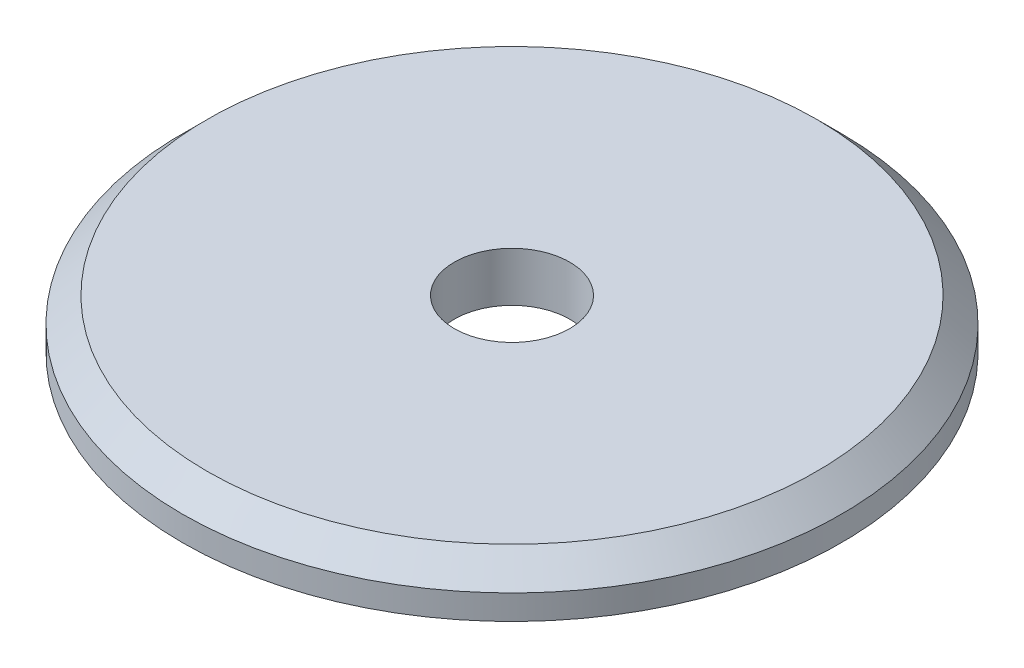
ISO-10303-21;
HEADER;
FILE_DESCRIPTION(('STEP AP214'),'2;1');
FILE_NAME('part.step','',(''),(''),'','','');
FILE_SCHEMA(('AUTOMOTIVE_DESIGN { 1 0 10303 214 1 1 1 1 }'));
ENDSEC;
DATA;
#1=APPLICATION_CONTEXT('core data for automotive mechanical design processes');
#2=APPLICATION_PROTOCOL_DEFINITION('international standard','automotive_design',2000,#1);
#3=PRODUCT_CONTEXT('',#1,'mechanical');
#4=PRODUCT('Part','Part','',(#3));
#5=PRODUCT_RELATED_PRODUCT_CATEGORY('part','',(#4));
#6=PRODUCT_DEFINITION_FORMATION('','',#4);
#7=PRODUCT_DEFINITION_CONTEXT('part definition',#1,'design');
#8=PRODUCT_DEFINITION('design','',#6,#7);
#9=PRODUCT_DEFINITION_SHAPE('','',#8);
#10=(LENGTH_UNIT() NAMED_UNIT(*) SI_UNIT(.MILLI.,.METRE.));
#11=(NAMED_UNIT(*) PLANE_ANGLE_UNIT() SI_UNIT($,.RADIAN.));
#12=(NAMED_UNIT(*) SI_UNIT($,.STERADIAN.) SOLID_ANGLE_UNIT());
#13=UNCERTAINTY_MEASURE_WITH_UNIT(LENGTH_MEASURE(1.E-05),#10,'distance_accuracy_value','');
#14=(GEOMETRIC_REPRESENTATION_CONTEXT(3) GLOBAL_UNCERTAINTY_ASSIGNED_CONTEXT((#13)) GLOBAL_UNIT_ASSIGNED_CONTEXT((#10,
#11,#12)) REPRESENTATION_CONTEXT('',''));
#15=CARTESIAN_POINT('',(0.,0.,0.));
#16=DIRECTION('',(0.,0.,1.));
#17=DIRECTION('',(1.,0.,0.));
#18=AXIS2_PLACEMENT_3D('',#15,#16,#17);
#19=CARTESIAN_POINT('',(0.,3.,0.));
#20=DIRECTION('',(0.,1.,0.));
#21=DIRECTION('',(0.,0.,1.));
#22=AXIS2_PLACEMENT_3D('',#19,#20,#21);
#23=PLANE('',#22);
#24=CARTESIAN_POINT('',(0.,3.,0.));
#25=DIRECTION('',(0.,1.,0.));
#26=DIRECTION('',(0.,0.,1.));
#27=AXIS2_PLACEMENT_3D('',#24,#25,#26);
#28=CIRCLE('',#27,18.5);
#29=CARTESIAN_POINT('',(0.,3.,18.5));
#30=VERTEX_POINT('',#29);
#31=EDGE_CURVE('E41',#30,#30,#28,.T.);
#32=ORIENTED_EDGE('',*,*,#31,.T.);
#33=EDGE_LOOP('',(#32));
#34=FACE_BOUND('',#33,.T.);
#35=CARTESIAN_POINT('',(0.,3.,0.));
#36=DIRECTION('',(0.,1.,0.));
#37=DIRECTION('',(0.,0.,1.));
#38=AXIS2_PLACEMENT_3D('',#35,#36,#37);
#39=CIRCLE('',#38,3.5);
#40=CARTESIAN_POINT('',(0.,3.,3.5));
#41=VERTEX_POINT('',#40);
#42=EDGE_CURVE('E49',#41,#41,#39,.T.);
#43=ORIENTED_EDGE('',*,*,#42,.F.);
#44=EDGE_LOOP('',(#43));
#45=FACE_BOUND('',#44,.T.);
#46=ADVANCED_FACE('F33',(#34,#45),#23,.T.);
#47=CARTESIAN_POINT('',(0.,0.,0.));
#48=DIRECTION('',(0.,1.,0.));
#49=DIRECTION('',(0.,0.,1.));
#50=AXIS2_PLACEMENT_3D('',#47,#48,#49);
#51=PLANE('',#50);
#52=CARTESIAN_POINT('',(0.,0.,0.));
#53=DIRECTION('',(0.,1.,0.));
#54=DIRECTION('',(0.,0.,1.));
#55=AXIS2_PLACEMENT_3D('',#52,#53,#54);
#56=CIRCLE('',#55,20.);
#57=CARTESIAN_POINT('',(0.,0.,20.));
#58=VERTEX_POINT('',#57);
#59=EDGE_CURVE('E45',#58,#58,#56,.T.);
#60=ORIENTED_EDGE('',*,*,#59,.F.);
#61=EDGE_LOOP('',(#60));
#62=FACE_BOUND('',#61,.T.);
#63=CARTESIAN_POINT('',(0.,0.,0.));
#64=DIRECTION('',(0.,1.,0.));
#65=DIRECTION('',(0.,0.,1.));
#66=AXIS2_PLACEMENT_3D('',#63,#64,#65);
#67=CIRCLE('',#66,3.5);
#68=CARTESIAN_POINT('',(0.,0.,3.5));
#69=VERTEX_POINT('',#68);
#70=EDGE_CURVE('E52',#69,#69,#67,.T.);
#71=ORIENTED_EDGE('',*,*,#70,.T.);
#72=EDGE_LOOP('',(#71));
#73=FACE_BOUND('',#72,.T.);
#74=ADVANCED_FACE('F62',(#62,#73),#51,.F.);
#75=CARTESIAN_POINT('',(0.,3.,0.));
#76=DIRECTION('',(0.,-1.,0.));
#77=DIRECTION('',(0.,0.,-1.));
#78=AXIS2_PLACEMENT_3D('',#75,#76,#77);
#79=CYLINDRICAL_SURFACE('',#78,20.);
#80=CARTESIAN_POINT('',(0.,1.49999999999998,0.));
#81=DIRECTION('',(0.,1.,0.));
#82=DIRECTION('',(0.,0.,1.));
#83=AXIS2_PLACEMENT_3D('',#80,#81,#82);
#84=CIRCLE('',#83,20.);
#85=CARTESIAN_POINT('',(0.,1.49999999999998,20.));
#86=VERTEX_POINT('',#85);
#87=EDGE_CURVE('E10',#86,#86,#84,.F.);
#88=ORIENTED_EDGE('',*,*,#87,.T.);
#89=EDGE_LOOP('',(#88));
#90=FACE_BOUND('',#89,.T.);
#91=ORIENTED_EDGE('',*,*,#59,.T.);
#92=EDGE_LOOP('',(#91));
#93=FACE_BOUND('',#92,.T.);
#94=ADVANCED_FACE('F67',(#90,#93),#79,.T.);
#95=CARTESIAN_POINT('',(0.,3.,0.));
#96=DIRECTION('',(0.,-1.,0.));
#97=DIRECTION('',(0.,0.,-1.));
#98=AXIS2_PLACEMENT_3D('',#95,#96,#97);
#99=CYLINDRICAL_SURFACE('',#98,3.5);
#100=ORIENTED_EDGE('',*,*,#42,.T.);
#101=EDGE_LOOP('',(#100));
#102=FACE_BOUND('',#101,.T.);
#103=ORIENTED_EDGE('',*,*,#70,.F.);
#104=EDGE_LOOP('',(#103));
#105=FACE_BOUND('',#104,.T.);
#106=ADVANCED_FACE('F58',(#102,#105),#99,.F.);
#107=CARTESIAN_POINT('',(0.,3.,0.));
#108=DIRECTION('',(0.,-1.,0.));
#109=DIRECTION('',(0.,0.,-1.));
#110=AXIS2_PLACEMENT_3D('',#107,#108,#109);
#111=CONICAL_SURFACE('',#110,18.5,0.785398163397445);
#112=ORIENTED_EDGE('',*,*,#87,.F.);
#113=EDGE_LOOP('',(#112));
#114=FACE_BOUND('',#113,.T.);
#115=ORIENTED_EDGE('',*,*,#31,.F.);
#116=EDGE_LOOP('',(#115));
#117=FACE_BOUND('',#116,.T.);
#118=ADVANCED_FACE('F36',(#114,#117),#111,.T.);
#119=CLOSED_SHELL('',(#46,#74,#94,#106,#118));
#120=MANIFOLD_SOLID_BREP('B2',#119);
#121=ADVANCED_BREP_SHAPE_REPRESENTATION('',(#18,#120),#14);
#122=SHAPE_DEFINITION_REPRESENTATION(#9,#121);
ENDSEC;
END-ISO-10303-21;
